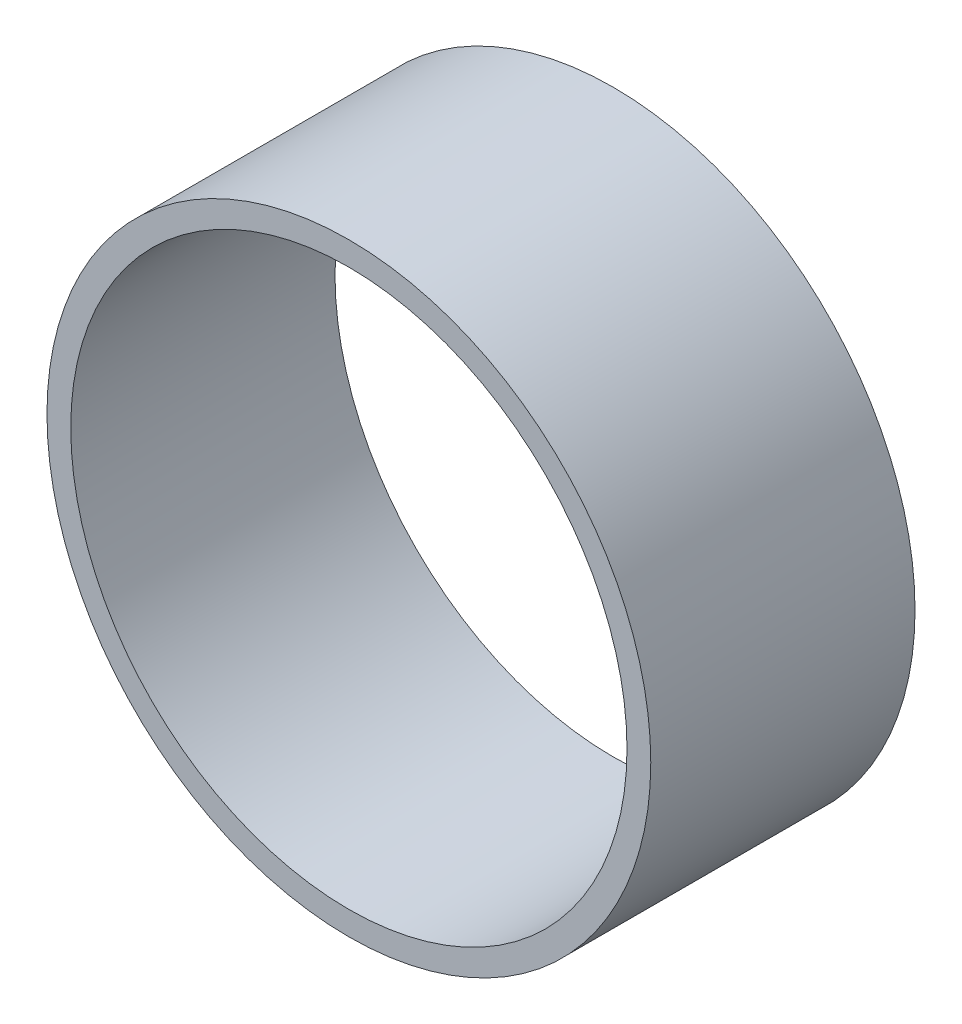
ISO-10303-21;
HEADER;
FILE_DESCRIPTION(('STEP AP214'),'2;1');
FILE_NAME('part.step','',(''),(''),'','','');
FILE_SCHEMA(('AUTOMOTIVE_DESIGN { 1 0 10303 214 1 1 1 1 }'));
ENDSEC;
DATA;
#1=APPLICATION_CONTEXT('core data for automotive mechanical design processes');
#2=APPLICATION_PROTOCOL_DEFINITION('international standard','automotive_design',2000,#1);
#3=PRODUCT_CONTEXT('',#1,'mechanical');
#4=PRODUCT('Part','Part','',(#3));
#5=PRODUCT_RELATED_PRODUCT_CATEGORY('part','',(#4));
#6=PRODUCT_DEFINITION_FORMATION('','',#4);
#7=PRODUCT_DEFINITION_CONTEXT('part definition',#1,'design');
#8=PRODUCT_DEFINITION('design','',#6,#7);
#9=PRODUCT_DEFINITION_SHAPE('','',#8);
#10=(LENGTH_UNIT() NAMED_UNIT(*) SI_UNIT(.MILLI.,.METRE.));
#11=(NAMED_UNIT(*) PLANE_ANGLE_UNIT() SI_UNIT($,.RADIAN.));
#12=(NAMED_UNIT(*) SI_UNIT($,.STERADIAN.) SOLID_ANGLE_UNIT());
#13=UNCERTAINTY_MEASURE_WITH_UNIT(LENGTH_MEASURE(1.E-05),#10,'distance_accuracy_value','');
#14=(GEOMETRIC_REPRESENTATION_CONTEXT(3) GLOBAL_UNCERTAINTY_ASSIGNED_CONTEXT((#13)) GLOBAL_UNIT_ASSIGNED_CONTEXT((#10,
#11,#12)) REPRESENTATION_CONTEXT('',''));
#15=CARTESIAN_POINT('',(0.,0.,0.));
#16=DIRECTION('',(0.,0.,1.));
#17=DIRECTION('',(1.,0.,0.));
#18=AXIS2_PLACEMENT_3D('',#15,#16,#17);
#19=CARTESIAN_POINT('',(0.,0.,20.));
#20=DIRECTION('',(0.,0.,1.));
#21=DIRECTION('',(1.,0.,0.));
#22=AXIS2_PLACEMENT_3D('',#19,#20,#21);
#23=PLANE('',#22);
#24=CARTESIAN_POINT('',(0.,0.,20.));
#25=DIRECTION('',(0.,0.,1.));
#26=DIRECTION('',(1.,0.,0.));
#27=AXIS2_PLACEMENT_3D('',#24,#25,#26);
#28=CIRCLE('',#27,22.85);
#29=CARTESIAN_POINT('',(22.85,0.,20.));
#30=VERTEX_POINT('',#29);
#31=EDGE_CURVE('E11',#30,#30,#28,.T.);
#32=ORIENTED_EDGE('',*,*,#31,.T.);
#33=EDGE_LOOP('',(#32));
#34=FACE_BOUND('',#33,.T.);
#35=CARTESIAN_POINT('',(0.,0.,20.));
#36=DIRECTION('',(0.,0.,1.));
#37=DIRECTION('',(1.,0.,0.));
#38=AXIS2_PLACEMENT_3D('',#35,#36,#37);
#39=CIRCLE('',#38,21.05);
#40=CARTESIAN_POINT('',(21.05,0.,20.));
#41=VERTEX_POINT('',#40);
#42=EDGE_CURVE('E50',#41,#41,#39,.T.);
#43=ORIENTED_EDGE('',*,*,#42,.F.);
#44=EDGE_LOOP('',(#43));
#45=FACE_BOUND('',#44,.T.);
#46=ADVANCED_FACE('F37',(#34,#45),#23,.T.);
#47=CARTESIAN_POINT('',(0.,0.,0.));
#48=DIRECTION('',(0.,0.,1.));
#49=DIRECTION('',(1.,0.,0.));
#50=AXIS2_PLACEMENT_3D('',#47,#48,#49);
#51=PLANE('',#50);
#52=CARTESIAN_POINT('',(0.,0.,0.));
#53=DIRECTION('',(0.,0.,1.));
#54=DIRECTION('',(1.,0.,0.));
#55=AXIS2_PLACEMENT_3D('',#52,#53,#54);
#56=CIRCLE('',#55,22.85);
#57=CARTESIAN_POINT('',(22.85,0.,0.));
#58=VERTEX_POINT('',#57);
#59=EDGE_CURVE('E45',#58,#58,#56,.T.);
#60=ORIENTED_EDGE('',*,*,#59,.F.);
#61=EDGE_LOOP('',(#60));
#62=FACE_BOUND('',#61,.T.);
#63=CARTESIAN_POINT('',(0.,0.,0.));
#64=DIRECTION('',(0.,0.,1.));
#65=DIRECTION('',(1.,0.,0.));
#66=AXIS2_PLACEMENT_3D('',#63,#64,#65);
#67=CIRCLE('',#66,21.05);
#68=CARTESIAN_POINT('',(21.05,0.,0.));
#69=VERTEX_POINT('',#68);
#70=EDGE_CURVE('E41',#69,#69,#67,.T.);
#71=ORIENTED_EDGE('',*,*,#70,.T.);
#72=EDGE_LOOP('',(#71));
#73=FACE_BOUND('',#72,.T.);
#74=ADVANCED_FACE('F58',(#62,#73),#51,.F.);
#75=CARTESIAN_POINT('',(0.,0.,20.));
#76=DIRECTION('',(0.,0.,-1.));
#77=DIRECTION('',(-1.,0.,0.));
#78=AXIS2_PLACEMENT_3D('',#75,#76,#77);
#79=CYLINDRICAL_SURFACE('',#78,22.85);
#80=ORIENTED_EDGE('',*,*,#31,.F.);
#81=EDGE_LOOP('',(#80));
#82=FACE_BOUND('',#81,.T.);
#83=ORIENTED_EDGE('',*,*,#59,.T.);
#84=EDGE_LOOP('',(#83));
#85=FACE_BOUND('',#84,.T.);
#86=ADVANCED_FACE('F61',(#82,#85),#79,.T.);
#87=CARTESIAN_POINT('',(0.,0.,20.));
#88=DIRECTION('',(0.,0.,-1.));
#89=DIRECTION('',(-1.,0.,0.));
#90=AXIS2_PLACEMENT_3D('',#87,#88,#89);
#91=CYLINDRICAL_SURFACE('',#90,21.05);
#92=ORIENTED_EDGE('',*,*,#42,.T.);
#93=EDGE_LOOP('',(#92));
#94=FACE_BOUND('',#93,.T.);
#95=ORIENTED_EDGE('',*,*,#70,.F.);
#96=EDGE_LOOP('',(#95));
#97=FACE_BOUND('',#96,.T.);
#98=ADVANCED_FACE('F39',(#94,#97),#91,.F.);
#99=CLOSED_SHELL('',(#46,#74,#86,#98));
#100=MANIFOLD_SOLID_BREP('B2',#99);
#101=ADVANCED_BREP_SHAPE_REPRESENTATION('',(#18,#100),#14);
#102=SHAPE_DEFINITION_REPRESENTATION(#9,#101);
ENDSEC;
END-ISO-10303-21;
